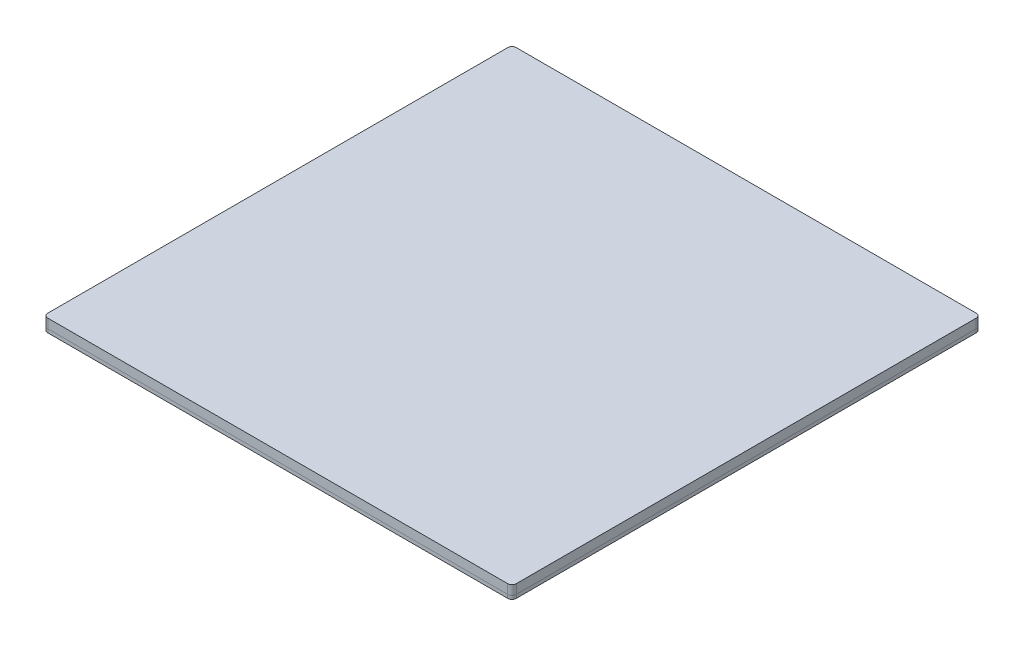
ISO-10303-21;
HEADER;
FILE_DESCRIPTION(('STEP AP214'),'2;1');
FILE_NAME('part.step','',(''),(''),'','','');
FILE_SCHEMA(('AUTOMOTIVE_DESIGN { 1 0 10303 214 1 1 1 1 }'));
ENDSEC;
DATA;
#1=APPLICATION_CONTEXT('core data for automotive mechanical design processes');
#2=APPLICATION_PROTOCOL_DEFINITION('international standard','automotive_design',2000,#1);
#3=PRODUCT_CONTEXT('',#1,'mechanical');
#4=PRODUCT('Part','Part','',(#3));
#5=PRODUCT_RELATED_PRODUCT_CATEGORY('part','',(#4));
#6=PRODUCT_DEFINITION_FORMATION('','',#4);
#7=PRODUCT_DEFINITION_CONTEXT('part definition',#1,'design');
#8=PRODUCT_DEFINITION('design','',#6,#7);
#9=PRODUCT_DEFINITION_SHAPE('','',#8);
#10=(LENGTH_UNIT() NAMED_UNIT(*) SI_UNIT(.MILLI.,.METRE.));
#11=(NAMED_UNIT(*) PLANE_ANGLE_UNIT() SI_UNIT($,.RADIAN.));
#12=(NAMED_UNIT(*) SI_UNIT($,.STERADIAN.) SOLID_ANGLE_UNIT());
#13=UNCERTAINTY_MEASURE_WITH_UNIT(LENGTH_MEASURE(1.E-05),#10,'distance_accuracy_value','');
#14=(GEOMETRIC_REPRESENTATION_CONTEXT(3) GLOBAL_UNCERTAINTY_ASSIGNED_CONTEXT((#13)) GLOBAL_UNIT_ASSIGNED_CONTEXT((#10,
#11,#12)) REPRESENTATION_CONTEXT('',''));
#15=CARTESIAN_POINT('',(0.,0.,0.));
#16=DIRECTION('',(0.,0.,1.));
#17=DIRECTION('',(1.,0.,0.));
#18=AXIS2_PLACEMENT_3D('',#15,#16,#17);
#19=CARTESIAN_POINT('',(-110.,-1.65,-110.));
#20=DIRECTION('',(0.,0.,1.));
#21=DIRECTION('',(1.,0.,0.));
#22=AXIS2_PLACEMENT_3D('',#19,#20,#21);
#23=PLANE('',#22);
#24=DIRECTION('',(1.,0.,0.));
#25=VECTOR('',#24,1.);
#26=CARTESIAN_POINT('',(-110.,-1.65,-110.));
#27=LINE('',#26,#25);
#28=CARTESIAN_POINT('',(-108.,-1.65,-110.));
#29=VERTEX_POINT('',#28);
#30=CARTESIAN_POINT('',(108.,-1.65,-110.));
#31=VERTEX_POINT('',#30);
#32=EDGE_CURVE('E130',#29,#31,#27,.T.);
#33=ORIENTED_EDGE('',*,*,#32,.F.);
#34=DIRECTION('',(0.,1.,0.));
#35=VECTOR('',#34,1.);
#36=CARTESIAN_POINT('',(-108.,-1.65,-110.));
#37=LINE('',#36,#35);
#38=CARTESIAN_POINT('',(-108.,0.,-110.));
#39=VERTEX_POINT('',#38);
#40=EDGE_CURVE('E115',#29,#39,#37,.T.);
#41=ORIENTED_EDGE('',*,*,#40,.T.);
#42=DIRECTION('',(1.,0.,0.));
#43=VECTOR('',#42,1.);
#44=CARTESIAN_POINT('',(-110.,0.,-110.));
#45=LINE('',#44,#43);
#46=CARTESIAN_POINT('',(108.,0.,-110.));
#47=VERTEX_POINT('',#46);
#48=EDGE_CURVE('E127',#39,#47,#45,.T.);
#49=ORIENTED_EDGE('',*,*,#48,.T.);
#50=DIRECTION('',(0.,1.,0.));
#51=VECTOR('',#50,1.);
#52=CARTESIAN_POINT('',(108.,-1.65,-110.));
#53=LINE('',#52,#51);
#54=EDGE_CURVE('E132',#47,#31,#53,.F.);
#55=ORIENTED_EDGE('',*,*,#54,.T.);
#56=EDGE_LOOP('',(#33,#41,#49,#55));
#57=FACE_BOUND('',#56,.T.);
#58=ADVANCED_FACE('F44',(#57),#23,.F.);
#59=CARTESIAN_POINT('',(110.,-1.65,-110.));
#60=DIRECTION('',(-1.,0.,0.));
#61=DIRECTION('',(0.,0.,1.));
#62=AXIS2_PLACEMENT_3D('',#59,#60,#61);
#63=PLANE('',#62);
#64=DIRECTION('',(0.,0.,1.));
#65=VECTOR('',#64,1.);
#66=CARTESIAN_POINT('',(110.,-1.65,-110.));
#67=LINE('',#66,#65);
#68=CARTESIAN_POINT('',(110.,-1.65,-108.));
#69=VERTEX_POINT('',#68);
#70=CARTESIAN_POINT('',(110.,-1.65,108.));
#71=VERTEX_POINT('',#70);
#72=EDGE_CURVE('E174',#69,#71,#67,.T.);
#73=ORIENTED_EDGE('',*,*,#72,.F.);
#74=DIRECTION('',(0.,1.,0.));
#75=VECTOR('',#74,1.);
#76=CARTESIAN_POINT('',(110.,-1.65,-108.));
#77=LINE('',#76,#75);
#78=CARTESIAN_POINT('',(110.,0.,-108.));
#79=VERTEX_POINT('',#78);
#80=EDGE_CURVE('E12',#69,#79,#77,.T.);
#81=ORIENTED_EDGE('',*,*,#80,.T.);
#82=DIRECTION('',(0.,0.,1.));
#83=VECTOR('',#82,1.);
#84=CARTESIAN_POINT('',(110.,0.,-110.));
#85=LINE('',#84,#83);
#86=CARTESIAN_POINT('',(110.,0.,108.));
#87=VERTEX_POINT('',#86);
#88=EDGE_CURVE('E137',#79,#87,#85,.T.);
#89=ORIENTED_EDGE('',*,*,#88,.T.);
#90=DIRECTION('',(0.,1.,0.));
#91=VECTOR('',#90,1.);
#92=CARTESIAN_POINT('',(110.,-1.65,108.));
#93=LINE('',#92,#91);
#94=EDGE_CURVE('E52',#87,#71,#93,.F.);
#95=ORIENTED_EDGE('',*,*,#94,.T.);
#96=EDGE_LOOP('',(#73,#81,#89,#95));
#97=FACE_BOUND('',#96,.T.);
#98=ADVANCED_FACE('F173',(#97),#63,.F.);
#99=CARTESIAN_POINT('',(110.,-1.65,110.));
#100=DIRECTION('',(0.,0.,-1.));
#101=DIRECTION('',(-1.,0.,0.));
#102=AXIS2_PLACEMENT_3D('',#99,#100,#101);
#103=PLANE('',#102);
#104=DIRECTION('',(-1.,0.,0.));
#105=VECTOR('',#104,1.);
#106=CARTESIAN_POINT('',(110.,0.,110.));
#107=LINE('',#106,#105);
#108=CARTESIAN_POINT('',(108.,0.,110.));
#109=VERTEX_POINT('',#108);
#110=CARTESIAN_POINT('',(-108.,0.,110.));
#111=VERTEX_POINT('',#110);
#112=EDGE_CURVE('E141',#109,#111,#107,.T.);
#113=ORIENTED_EDGE('',*,*,#112,.T.);
#114=DIRECTION('',(0.,1.,0.));
#115=VECTOR('',#114,1.);
#116=CARTESIAN_POINT('',(-108.,-1.65,110.));
#117=LINE('',#116,#115);
#118=CARTESIAN_POINT('',(-108.,-1.65,110.));
#119=VERTEX_POINT('',#118);
#120=EDGE_CURVE('E59',#111,#119,#117,.F.);
#121=ORIENTED_EDGE('',*,*,#120,.T.);
#122=DIRECTION('',(-1.,0.,0.));
#123=VECTOR('',#122,1.);
#124=CARTESIAN_POINT('',(110.,-1.65,110.));
#125=LINE('',#124,#123);
#126=CARTESIAN_POINT('',(108.,-1.65,110.));
#127=VERTEX_POINT('',#126);
#128=EDGE_CURVE('E180',#127,#119,#125,.T.);
#129=ORIENTED_EDGE('',*,*,#128,.F.);
#130=DIRECTION('',(0.,1.,0.));
#131=VECTOR('',#130,1.);
#132=CARTESIAN_POINT('',(108.,-1.65,110.));
#133=LINE('',#132,#131);
#134=EDGE_CURVE('E167',#127,#109,#133,.T.);
#135=ORIENTED_EDGE('',*,*,#134,.T.);
#136=EDGE_LOOP('',(#113,#121,#129,#135));
#137=FACE_BOUND('',#136,.T.);
#138=ADVANCED_FACE('F184',(#137),#103,.F.);
#139=CARTESIAN_POINT('',(-110.,-1.65,110.));
#140=DIRECTION('',(1.,0.,0.));
#141=DIRECTION('',(0.,0.,-1.));
#142=AXIS2_PLACEMENT_3D('',#139,#140,#141);
#143=PLANE('',#142);
#144=DIRECTION('',(0.,0.,-1.));
#145=VECTOR('',#144,1.);
#146=CARTESIAN_POINT('',(-110.,0.,110.));
#147=LINE('',#146,#145);
#148=CARTESIAN_POINT('',(-110.,0.,108.));
#149=VERTEX_POINT('',#148);
#150=CARTESIAN_POINT('',(-110.,0.,-108.));
#151=VERTEX_POINT('',#150);
#152=EDGE_CURVE('E151',#149,#151,#147,.T.);
#153=ORIENTED_EDGE('',*,*,#152,.T.);
#154=DIRECTION('',(0.,1.,0.));
#155=VECTOR('',#154,1.);
#156=CARTESIAN_POINT('',(-110.,-1.65,-108.));
#157=LINE('',#156,#155);
#158=CARTESIAN_POINT('',(-110.,-1.65,-108.));
#159=VERTEX_POINT('',#158);
#160=EDGE_CURVE('E116',#151,#159,#157,.F.);
#161=ORIENTED_EDGE('',*,*,#160,.T.);
#162=DIRECTION('',(0.,0.,-1.));
#163=VECTOR('',#162,1.);
#164=CARTESIAN_POINT('',(-110.,-1.65,110.));
#165=LINE('',#164,#163);
#166=CARTESIAN_POINT('',(-110.,-1.65,108.));
#167=VERTEX_POINT('',#166);
#168=EDGE_CURVE('E147',#167,#159,#165,.T.);
#169=ORIENTED_EDGE('',*,*,#168,.F.);
#170=DIRECTION('',(0.,1.,0.));
#171=VECTOR('',#170,1.);
#172=CARTESIAN_POINT('',(-110.,-1.65,108.));
#173=LINE('',#172,#171);
#174=EDGE_CURVE('E121',#167,#149,#173,.T.);
#175=ORIENTED_EDGE('',*,*,#174,.T.);
#176=EDGE_LOOP('',(#153,#161,#169,#175));
#177=FACE_BOUND('',#176,.T.);
#178=ADVANCED_FACE('F191',(#177),#143,.F.);
#179=CARTESIAN_POINT('',(0.,-1.65,0.));
#180=DIRECTION('',(0.,-1.,0.));
#181=DIRECTION('',(0.,0.,-1.));
#182=AXIS2_PLACEMENT_3D('',#179,#180,#181);
#183=PLANE('',#182);
#184=CARTESIAN_POINT('',(-104.5,-1.65,-104.5));
#185=DIRECTION('',(0.,1.,0.));
#186=DIRECTION('',(0.,0.,1.));
#187=AXIS2_PLACEMENT_3D('',#184,#185,#186);
#188=CIRCLE('',#187,1.5);
#189=CARTESIAN_POINT('',(-104.5,-1.65,-103.));
#190=VERTEX_POINT('',#189);
#191=EDGE_CURVE('E138',#190,#190,#188,.T.);
#192=ORIENTED_EDGE('',*,*,#191,.T.);
#193=EDGE_LOOP('',(#192));
#194=FACE_BOUND('',#193,.T.);
#195=CARTESIAN_POINT('',(104.5,-1.65,-104.5));
#196=DIRECTION('',(0.,1.,0.));
#197=DIRECTION('',(0.,0.,1.));
#198=AXIS2_PLACEMENT_3D('',#195,#196,#197);
#199=CIRCLE('',#198,1.5);
#200=CARTESIAN_POINT('',(104.5,-1.65,-103.));
#201=VERTEX_POINT('',#200);
#202=EDGE_CURVE('E209',#201,#201,#199,.T.);
#203=ORIENTED_EDGE('',*,*,#202,.T.);
#204=EDGE_LOOP('',(#203));
#205=FACE_BOUND('',#204,.T.);
#206=CARTESIAN_POINT('',(104.5,-1.65,104.5));
#207=DIRECTION('',(0.,1.,0.));
#208=DIRECTION('',(0.,0.,1.));
#209=AXIS2_PLACEMENT_3D('',#206,#207,#208);
#210=CIRCLE('',#209,1.5);
#211=CARTESIAN_POINT('',(104.5,-1.65,106.));
#212=VERTEX_POINT('',#211);
#213=EDGE_CURVE('E203',#212,#212,#210,.T.);
#214=ORIENTED_EDGE('',*,*,#213,.T.);
#215=EDGE_LOOP('',(#214));
#216=FACE_BOUND('',#215,.T.);
#217=CARTESIAN_POINT('',(-104.5,-1.65,104.5));
#218=DIRECTION('',(0.,1.,0.));
#219=DIRECTION('',(0.,0.,1.));
#220=AXIS2_PLACEMENT_3D('',#217,#218,#219);
#221=CIRCLE('',#220,1.5);
#222=CARTESIAN_POINT('',(-104.5,-1.65,106.));
#223=VERTEX_POINT('',#222);
#224=EDGE_CURVE('E197',#223,#223,#221,.T.);
#225=ORIENTED_EDGE('',*,*,#224,.T.);
#226=EDGE_LOOP('',(#225));
#227=FACE_BOUND('',#226,.T.);
#228=ORIENTED_EDGE('',*,*,#168,.T.);
#229=CARTESIAN_POINT('',(-108.,-1.65,-108.));
#230=DIRECTION('',(0.,-1.,0.));
#231=DIRECTION('',(0.,0.,-1.));
#232=AXIS2_PLACEMENT_3D('',#229,#230,#231);
#233=CIRCLE('',#232,2.);
#234=EDGE_CURVE('E165',#159,#29,#233,.T.);
#235=ORIENTED_EDGE('',*,*,#234,.T.);
#236=ORIENTED_EDGE('',*,*,#32,.T.);
#237=CARTESIAN_POINT('',(108.,-1.65,-108.));
#238=DIRECTION('',(0.,-1.,0.));
#239=DIRECTION('',(0.,0.,-1.));
#240=AXIS2_PLACEMENT_3D('',#237,#238,#239);
#241=CIRCLE('',#240,2.);
#242=EDGE_CURVE('E161',#31,#69,#241,.T.);
#243=ORIENTED_EDGE('',*,*,#242,.T.);
#244=ORIENTED_EDGE('',*,*,#72,.T.);
#245=CARTESIAN_POINT('',(108.,-1.65,108.));
#246=DIRECTION('',(0.,-1.,0.));
#247=DIRECTION('',(0.,0.,-1.));
#248=AXIS2_PLACEMENT_3D('',#245,#246,#247);
#249=CIRCLE('',#248,2.);
#250=EDGE_CURVE('E66',#71,#127,#249,.T.);
#251=ORIENTED_EDGE('',*,*,#250,.T.);
#252=ORIENTED_EDGE('',*,*,#128,.T.);
#253=CARTESIAN_POINT('',(-108.,-1.65,108.));
#254=DIRECTION('',(0.,-1.,0.));
#255=DIRECTION('',(0.,0.,-1.));
#256=AXIS2_PLACEMENT_3D('',#253,#254,#255);
#257=CIRCLE('',#256,2.);
#258=EDGE_CURVE('E163',#119,#167,#257,.T.);
#259=ORIENTED_EDGE('',*,*,#258,.T.);
#260=EDGE_LOOP('',(#228,#235,#236,#243,#244,#251,#252,#259));
#261=FACE_BOUND('',#260,.T.);
#262=ADVANCED_FACE('F178',(#194,#205,#216,#227,#261),#183,.T.);
#263=CARTESIAN_POINT('',(0.,0.,0.));
#264=DIRECTION('',(0.,-1.,0.));
#265=DIRECTION('',(0.,0.,-1.));
#266=AXIS2_PLACEMENT_3D('',#263,#264,#265);
#267=PLANE('',#266);
#268=CARTESIAN_POINT('',(-104.5,0.,-104.5));
#269=DIRECTION('',(0.,1.,0.));
#270=DIRECTION('',(0.,0.,1.));
#271=AXIS2_PLACEMENT_3D('',#268,#269,#270);
#272=CIRCLE('',#271,1.5);
#273=CARTESIAN_POINT('',(-104.5,0.,-103.));
#274=VERTEX_POINT('',#273);
#275=EDGE_CURVE('E144',#274,#274,#272,.T.);
#276=ORIENTED_EDGE('',*,*,#275,.F.);
#277=EDGE_LOOP('',(#276));
#278=FACE_BOUND('',#277,.T.);
#279=CARTESIAN_POINT('',(104.5,0.,-104.5));
#280=DIRECTION('',(0.,1.,0.));
#281=DIRECTION('',(0.,0.,1.));
#282=AXIS2_PLACEMENT_3D('',#279,#280,#281);
#283=CIRCLE('',#282,1.5);
#284=CARTESIAN_POINT('',(104.5,0.,-103.));
#285=VERTEX_POINT('',#284);
#286=EDGE_CURVE('E206',#285,#285,#283,.T.);
#287=ORIENTED_EDGE('',*,*,#286,.F.);
#288=EDGE_LOOP('',(#287));
#289=FACE_BOUND('',#288,.T.);
#290=CARTESIAN_POINT('',(104.5,0.,104.5));
#291=DIRECTION('',(0.,1.,0.));
#292=DIRECTION('',(0.,0.,1.));
#293=AXIS2_PLACEMENT_3D('',#290,#291,#292);
#294=CIRCLE('',#293,1.5);
#295=CARTESIAN_POINT('',(104.5,0.,106.));
#296=VERTEX_POINT('',#295);
#297=EDGE_CURVE('E200',#296,#296,#294,.T.);
#298=ORIENTED_EDGE('',*,*,#297,.F.);
#299=EDGE_LOOP('',(#298));
#300=FACE_BOUND('',#299,.T.);
#301=CARTESIAN_POINT('',(-104.5,0.,104.5));
#302=DIRECTION('',(0.,1.,0.));
#303=DIRECTION('',(0.,0.,1.));
#304=AXIS2_PLACEMENT_3D('',#301,#302,#303);
#305=CIRCLE('',#304,1.5);
#306=CARTESIAN_POINT('',(-104.5,0.,106.));
#307=VERTEX_POINT('',#306);
#308=EDGE_CURVE('E194',#307,#307,#305,.T.);
#309=ORIENTED_EDGE('',*,*,#308,.F.);
#310=EDGE_LOOP('',(#309));
#311=FACE_BOUND('',#310,.T.);
#312=ORIENTED_EDGE('',*,*,#48,.F.);
#313=CARTESIAN_POINT('',(-108.,0.,-108.));
#314=DIRECTION('',(0.,-1.,0.));
#315=DIRECTION('',(0.,0.,-1.));
#316=AXIS2_PLACEMENT_3D('',#313,#314,#315);
#317=CIRCLE('',#316,2.);
#318=EDGE_CURVE('E111',#39,#151,#317,.F.);
#319=ORIENTED_EDGE('',*,*,#318,.T.);
#320=ORIENTED_EDGE('',*,*,#152,.F.);
#321=CARTESIAN_POINT('',(-108.,0.,108.));
#322=DIRECTION('',(0.,-1.,0.));
#323=DIRECTION('',(0.,0.,-1.));
#324=AXIS2_PLACEMENT_3D('',#321,#322,#323);
#325=CIRCLE('',#324,2.);
#326=EDGE_CURVE('E122',#149,#111,#325,.F.);
#327=ORIENTED_EDGE('',*,*,#326,.T.);
#328=ORIENTED_EDGE('',*,*,#112,.F.);
#329=CARTESIAN_POINT('',(108.,0.,108.));
#330=DIRECTION('',(0.,-1.,0.));
#331=DIRECTION('',(0.,0.,-1.));
#332=AXIS2_PLACEMENT_3D('',#329,#330,#331);
#333=CIRCLE('',#332,2.);
#334=EDGE_CURVE('E131',#109,#87,#333,.F.);
#335=ORIENTED_EDGE('',*,*,#334,.T.);
#336=ORIENTED_EDGE('',*,*,#88,.F.);
#337=CARTESIAN_POINT('',(108.,0.,-108.));
#338=DIRECTION('',(0.,-1.,0.));
#339=DIRECTION('',(0.,0.,-1.));
#340=AXIS2_PLACEMENT_3D('',#337,#338,#339);
#341=CIRCLE('',#340,2.);
#342=EDGE_CURVE('E136',#79,#47,#341,.F.);
#343=ORIENTED_EDGE('',*,*,#342,.T.);
#344=EDGE_LOOP('',(#312,#319,#320,#327,#328,#335,#336,#343));
#345=FACE_BOUND('',#344,.T.);
#346=ADVANCED_FACE('F134',(#278,#289,#300,#311,#345),#267,.F.);
#347=CARTESIAN_POINT('',(-104.5,-1.65,104.5));
#348=DIRECTION('',(0.,1.,0.));
#349=DIRECTION('',(0.,0.,1.));
#350=AXIS2_PLACEMENT_3D('',#347,#348,#349);
#351=CYLINDRICAL_SURFACE('',#350,1.5);
#352=ORIENTED_EDGE('',*,*,#224,.F.);
#353=EDGE_LOOP('',(#352));
#354=FACE_BOUND('',#353,.T.);
#355=ORIENTED_EDGE('',*,*,#308,.T.);
#356=EDGE_LOOP('',(#355));
#357=FACE_BOUND('',#356,.T.);
#358=ADVANCED_FACE('F219',(#354,#357),#351,.F.);
#359=CARTESIAN_POINT('',(104.5,-1.65,104.5));
#360=DIRECTION('',(0.,1.,0.));
#361=DIRECTION('',(0.,0.,1.));
#362=AXIS2_PLACEMENT_3D('',#359,#360,#361);
#363=CYLINDRICAL_SURFACE('',#362,1.5);
#364=ORIENTED_EDGE('',*,*,#213,.F.);
#365=EDGE_LOOP('',(#364));
#366=FACE_BOUND('',#365,.T.);
#367=ORIENTED_EDGE('',*,*,#297,.T.);
#368=EDGE_LOOP('',(#367));
#369=FACE_BOUND('',#368,.T.);
#370=ADVANCED_FACE('F228',(#366,#369),#363,.F.);
#371=CARTESIAN_POINT('',(104.5,-1.65,-104.5));
#372=DIRECTION('',(0.,1.,0.));
#373=DIRECTION('',(0.,0.,1.));
#374=AXIS2_PLACEMENT_3D('',#371,#372,#373);
#375=CYLINDRICAL_SURFACE('',#374,1.5);
#376=ORIENTED_EDGE('',*,*,#202,.F.);
#377=EDGE_LOOP('',(#376));
#378=FACE_BOUND('',#377,.T.);
#379=ORIENTED_EDGE('',*,*,#286,.T.);
#380=EDGE_LOOP('',(#379));
#381=FACE_BOUND('',#380,.T.);
#382=ADVANCED_FACE('F234',(#378,#381),#375,.F.);
#383=CARTESIAN_POINT('',(-104.5,-1.65,-104.5));
#384=DIRECTION('',(0.,1.,0.));
#385=DIRECTION('',(0.,0.,1.));
#386=AXIS2_PLACEMENT_3D('',#383,#384,#385);
#387=CYLINDRICAL_SURFACE('',#386,1.5);
#388=ORIENTED_EDGE('',*,*,#191,.F.);
#389=EDGE_LOOP('',(#388));
#390=FACE_BOUND('',#389,.T.);
#391=ORIENTED_EDGE('',*,*,#275,.T.);
#392=EDGE_LOOP('',(#391));
#393=FACE_BOUND('',#392,.T.);
#394=ADVANCED_FACE('F215',(#390,#393),#387,.F.);
#395=CARTESIAN_POINT('',(-108.,-1.65,-108.));
#396=DIRECTION('',(0.,1.,0.));
#397=DIRECTION('',(0.,0.,1.));
#398=AXIS2_PLACEMENT_3D('',#395,#396,#397);
#399=CYLINDRICAL_SURFACE('',#398,2.);
#400=ORIENTED_EDGE('',*,*,#234,.F.);
#401=ORIENTED_EDGE('',*,*,#160,.F.);
#402=ORIENTED_EDGE('',*,*,#318,.F.);
#403=ORIENTED_EDGE('',*,*,#40,.F.);
#404=EDGE_LOOP('',(#400,#401,#402,#403));
#405=FACE_BOUND('',#404,.T.);
#406=ADVANCED_FACE('F114',(#405),#399,.T.);
#407=CARTESIAN_POINT('',(-108.,-1.65,108.));
#408=DIRECTION('',(0.,1.,0.));
#409=DIRECTION('',(0.,0.,1.));
#410=AXIS2_PLACEMENT_3D('',#407,#408,#409);
#411=CYLINDRICAL_SURFACE('',#410,2.);
#412=ORIENTED_EDGE('',*,*,#258,.F.);
#413=ORIENTED_EDGE('',*,*,#120,.F.);
#414=ORIENTED_EDGE('',*,*,#326,.F.);
#415=ORIENTED_EDGE('',*,*,#174,.F.);
#416=EDGE_LOOP('',(#412,#413,#414,#415));
#417=FACE_BOUND('',#416,.T.);
#418=ADVANCED_FACE('F188',(#417),#411,.T.);
#419=CARTESIAN_POINT('',(108.,-1.65,-108.));
#420=DIRECTION('',(0.,1.,0.));
#421=DIRECTION('',(0.,0.,1.));
#422=AXIS2_PLACEMENT_3D('',#419,#420,#421);
#423=CYLINDRICAL_SURFACE('',#422,2.);
#424=ORIENTED_EDGE('',*,*,#242,.F.);
#425=ORIENTED_EDGE('',*,*,#54,.F.);
#426=ORIENTED_EDGE('',*,*,#342,.F.);
#427=ORIENTED_EDGE('',*,*,#80,.F.);
#428=EDGE_LOOP('',(#424,#425,#426,#427));
#429=FACE_BOUND('',#428,.T.);
#430=ADVANCED_FACE('F250',(#429),#423,.T.);
#431=CARTESIAN_POINT('',(108.,-1.65,108.));
#432=DIRECTION('',(0.,1.,0.));
#433=DIRECTION('',(0.,0.,1.));
#434=AXIS2_PLACEMENT_3D('',#431,#432,#433);
#435=CYLINDRICAL_SURFACE('',#434,2.);
#436=ORIENTED_EDGE('',*,*,#250,.F.);
#437=ORIENTED_EDGE('',*,*,#94,.F.);
#438=ORIENTED_EDGE('',*,*,#334,.F.);
#439=ORIENTED_EDGE('',*,*,#134,.F.);
#440=EDGE_LOOP('',(#436,#437,#438,#439));
#441=FACE_BOUND('',#440,.T.);
#442=ADVANCED_FACE('F46',(#441),#435,.T.);
#443=CLOSED_SHELL('',(#58,#98,#138,#178,#262,#346,#358,#370,#382,#394,#406,#418,#430,#442));
#444=MANIFOLD_SOLID_BREP('B2',#443);
#445=CARTESIAN_POINT('',(110.,4.35,110.));
#446=DIRECTION('',(-1.,0.,0.));
#447=DIRECTION('',(0.,0.,1.));
#448=AXIS2_PLACEMENT_3D('',#445,#446,#447);
#449=PLANE('',#448);
#450=DIRECTION('',(0.,0.,-1.));
#451=VECTOR('',#450,1.);
#452=CARTESIAN_POINT('',(110.,4.35,110.));
#453=LINE('',#452,#451);
#454=CARTESIAN_POINT('',(110.,4.35,108.));
#455=VERTEX_POINT('',#454);
#456=CARTESIAN_POINT('',(110.,4.35,-108.));
#457=VERTEX_POINT('',#456);
#458=EDGE_CURVE('E442',#455,#457,#453,.T.);
#459=ORIENTED_EDGE('',*,*,#458,.F.);
#460=DIRECTION('',(0.,-1.,0.));
#461=VECTOR('',#460,1.);
#462=CARTESIAN_POINT('',(110.,4.35,108.));
#463=LINE('',#462,#461);
#464=CARTESIAN_POINT('',(110.,0.,108.));
#465=VERTEX_POINT('',#464);
#466=EDGE_CURVE('E427',#455,#465,#463,.T.);
#467=ORIENTED_EDGE('',*,*,#466,.T.);
#468=DIRECTION('',(0.,0.,-1.));
#469=VECTOR('',#468,1.);
#470=CARTESIAN_POINT('',(110.,0.,110.));
#471=LINE('',#470,#469);
#472=CARTESIAN_POINT('',(110.,0.,-108.));
#473=VERTEX_POINT('',#472);
#474=EDGE_CURVE('E439',#465,#473,#471,.T.);
#475=ORIENTED_EDGE('',*,*,#474,.T.);
#476=DIRECTION('',(0.,-1.,0.));
#477=VECTOR('',#476,1.);
#478=CARTESIAN_POINT('',(110.,4.35,-108.));
#479=LINE('',#478,#477);
#480=EDGE_CURVE('E444',#473,#457,#479,.F.);
#481=ORIENTED_EDGE('',*,*,#480,.T.);
#482=EDGE_LOOP('',(#459,#467,#475,#481));
#483=FACE_BOUND('',#482,.T.);
#484=ADVANCED_FACE('F357',(#483),#449,.F.);
#485=CARTESIAN_POINT('',(-110.,4.35,-110.));
#486=DIRECTION('',(0.,0.,1.));
#487=DIRECTION('',(1.,0.,0.));
#488=AXIS2_PLACEMENT_3D('',#485,#486,#487);
#489=PLANE('',#488);
#490=DIRECTION('',(-1.,0.,0.));
#491=VECTOR('',#490,1.);
#492=CARTESIAN_POINT('',(-110.,4.35,-110.));
#493=LINE('',#492,#491);
#494=CARTESIAN_POINT('',(108.,4.35,-110.));
#495=VERTEX_POINT('',#494);
#496=CARTESIAN_POINT('',(-108.,4.35,-110.));
#497=VERTEX_POINT('',#496);
#498=EDGE_CURVE('E484',#495,#497,#493,.T.);
#499=ORIENTED_EDGE('',*,*,#498,.F.);
#500=DIRECTION('',(0.,-1.,0.));
#501=VECTOR('',#500,1.);
#502=CARTESIAN_POINT('',(108.,4.35,-110.));
#503=LINE('',#502,#501);
#504=CARTESIAN_POINT('',(108.,0.,-110.));
#505=VERTEX_POINT('',#504);
#506=EDGE_CURVE('E477',#495,#505,#503,.T.);
#507=ORIENTED_EDGE('',*,*,#506,.T.);
#508=DIRECTION('',(-1.,0.,0.));
#509=VECTOR('',#508,1.);
#510=CARTESIAN_POINT('',(-110.,0.,-110.));
#511=LINE('',#510,#509);
#512=CARTESIAN_POINT('',(-108.,0.,-110.));
#513=VERTEX_POINT('',#512);
#514=EDGE_CURVE('E448',#505,#513,#511,.T.);
#515=ORIENTED_EDGE('',*,*,#514,.T.);
#516=DIRECTION('',(0.,-1.,0.));
#517=VECTOR('',#516,1.);
#518=CARTESIAN_POINT('',(-108.,4.35,-110.));
#519=LINE('',#518,#517);
#520=EDGE_CURVE('E475',#513,#497,#519,.F.);
#521=ORIENTED_EDGE('',*,*,#520,.T.);
#522=EDGE_LOOP('',(#499,#507,#515,#521));
#523=FACE_BOUND('',#522,.T.);
#524=ADVANCED_FACE('F482',(#523),#489,.F.);
#525=CARTESIAN_POINT('',(-110.,4.35,110.));
#526=DIRECTION('',(1.,0.,0.));
#527=DIRECTION('',(0.,0.,-1.));
#528=AXIS2_PLACEMENT_3D('',#525,#526,#527);
#529=PLANE('',#528);
#530=DIRECTION('',(0.,0.,1.));
#531=VECTOR('',#530,1.);
#532=CARTESIAN_POINT('',(-110.,4.35,110.));
#533=LINE('',#532,#531);
#534=CARTESIAN_POINT('',(-110.,4.35,-108.));
#535=VERTEX_POINT('',#534);
#536=CARTESIAN_POINT('',(-110.,4.35,108.));
#537=VERTEX_POINT('',#536);
#538=EDGE_CURVE('E492',#535,#537,#533,.T.);
#539=ORIENTED_EDGE('',*,*,#538,.F.);
#540=DIRECTION('',(0.,-1.,0.));
#541=VECTOR('',#540,1.);
#542=CARTESIAN_POINT('',(-110.,4.35,-108.));
#543=LINE('',#542,#541);
#544=CARTESIAN_POINT('',(-110.,0.,-108.));
#545=VERTEX_POINT('',#544);
#546=EDGE_CURVE('E42',#535,#545,#543,.T.);
#547=ORIENTED_EDGE('',*,*,#546,.T.);
#548=DIRECTION('',(0.,0.,1.));
#549=VECTOR('',#548,1.);
#550=CARTESIAN_POINT('',(-110.,0.,110.));
#551=LINE('',#550,#549);
#552=CARTESIAN_POINT('',(-110.,0.,108.));
#553=VERTEX_POINT('',#552);
#554=EDGE_CURVE('E451',#545,#553,#551,.T.);
#555=ORIENTED_EDGE('',*,*,#554,.T.);
#556=DIRECTION('',(0.,-1.,0.));
#557=VECTOR('',#556,1.);
#558=CARTESIAN_POINT('',(-110.,4.35,108.));
#559=LINE('',#558,#557);
#560=EDGE_CURVE('E365',#553,#537,#559,.F.);
#561=ORIENTED_EDGE('',*,*,#560,.T.);
#562=EDGE_LOOP('',(#539,#547,#555,#561));
#563=FACE_BOUND('',#562,.T.);
#564=ADVANCED_FACE('F491',(#563),#529,.F.);
#565=CARTESIAN_POINT('',(-110.,4.35,110.));
#566=DIRECTION('',(0.,0.,-1.));
#567=DIRECTION('',(-1.,0.,0.));
#568=AXIS2_PLACEMENT_3D('',#565,#566,#567);
#569=PLANE('',#568);
#570=DIRECTION('',(1.,0.,0.));
#571=VECTOR('',#570,1.);
#572=CARTESIAN_POINT('',(-110.,0.,110.));
#573=LINE('',#572,#571);
#574=CARTESIAN_POINT('',(-108.,0.,110.));
#575=VERTEX_POINT('',#574);
#576=CARTESIAN_POINT('',(108.,0.,110.));
#577=VERTEX_POINT('',#576);
#578=EDGE_CURVE('E458',#575,#577,#573,.T.);
#579=ORIENTED_EDGE('',*,*,#578,.T.);
#580=DIRECTION('',(0.,-1.,0.));
#581=VECTOR('',#580,1.);
#582=CARTESIAN_POINT('',(108.,4.35,110.));
#583=LINE('',#582,#581);
#584=CARTESIAN_POINT('',(108.,4.35,110.));
#585=VERTEX_POINT('',#584);
#586=EDGE_CURVE('E428',#577,#585,#583,.F.);
#587=ORIENTED_EDGE('',*,*,#586,.T.);
#588=DIRECTION('',(1.,0.,0.));
#589=VECTOR('',#588,1.);
#590=CARTESIAN_POINT('',(-110.,4.35,110.));
#591=LINE('',#590,#589);
#592=CARTESIAN_POINT('',(-108.,4.35,110.));
#593=VERTEX_POINT('',#592);
#594=EDGE_CURVE('E454',#593,#585,#591,.T.);
#595=ORIENTED_EDGE('',*,*,#594,.F.);
#596=DIRECTION('',(0.,-1.,0.));
#597=VECTOR('',#596,1.);
#598=CARTESIAN_POINT('',(-108.,4.35,110.));
#599=LINE('',#598,#597);
#600=EDGE_CURVE('E433',#593,#575,#599,.T.);
#601=ORIENTED_EDGE('',*,*,#600,.T.);
#602=EDGE_LOOP('',(#579,#587,#595,#601));
#603=FACE_BOUND('',#602,.T.);
#604=ADVANCED_FACE('F515',(#603),#569,.F.);
#605=CARTESIAN_POINT('',(0.,4.35,0.));
#606=DIRECTION('',(0.,-1.,0.));
#607=DIRECTION('',(0.,0.,-1.));
#608=AXIS2_PLACEMENT_3D('',#605,#606,#607);
#609=PLANE('',#608);
#610=ORIENTED_EDGE('',*,*,#594,.T.);
#611=CARTESIAN_POINT('',(108.,4.35,108.));
#612=DIRECTION('',(0.,-1.,0.));
#613=DIRECTION('',(0.,0.,-1.));
#614=AXIS2_PLACEMENT_3D('',#611,#612,#613);
#615=CIRCLE('',#614,2.);
#616=EDGE_CURVE('E473',#585,#455,#615,.F.);
#617=ORIENTED_EDGE('',*,*,#616,.T.);
#618=ORIENTED_EDGE('',*,*,#458,.T.);
#619=CARTESIAN_POINT('',(108.,4.35,-108.));
#620=DIRECTION('',(0.,-1.,0.));
#621=DIRECTION('',(0.,0.,-1.));
#622=AXIS2_PLACEMENT_3D('',#619,#620,#621);
#623=CIRCLE('',#622,2.);
#624=EDGE_CURVE('E471',#457,#495,#623,.F.);
#625=ORIENTED_EDGE('',*,*,#624,.T.);
#626=ORIENTED_EDGE('',*,*,#498,.T.);
#627=CARTESIAN_POINT('',(-108.,4.35,-108.));
#628=DIRECTION('',(0.,-1.,0.));
#629=DIRECTION('',(0.,0.,-1.));
#630=AXIS2_PLACEMENT_3D('',#627,#628,#629);
#631=CIRCLE('',#630,2.);
#632=EDGE_CURVE('E378',#497,#535,#631,.F.);
#633=ORIENTED_EDGE('',*,*,#632,.T.);
#634=ORIENTED_EDGE('',*,*,#538,.T.);
#635=CARTESIAN_POINT('',(-108.,4.35,108.));
#636=DIRECTION('',(0.,-1.,0.));
#637=DIRECTION('',(0.,0.,-1.));
#638=AXIS2_PLACEMENT_3D('',#635,#636,#637);
#639=CIRCLE('',#638,2.);
#640=EDGE_CURVE('E468',#537,#593,#639,.F.);
#641=ORIENTED_EDGE('',*,*,#640,.T.);
#642=EDGE_LOOP('',(#610,#617,#618,#625,#626,#633,#634,#641));
#643=FACE_BOUND('',#642,.T.);
#644=ADVANCED_FACE('F497',(#643),#609,.F.);
#645=CARTESIAN_POINT('',(0.,0.,0.));
#646=DIRECTION('',(0.,-1.,0.));
#647=DIRECTION('',(0.,0.,-1.));
#648=AXIS2_PLACEMENT_3D('',#645,#646,#647);
#649=PLANE('',#648);
#650=ORIENTED_EDGE('',*,*,#474,.F.);
#651=CARTESIAN_POINT('',(108.,0.,108.));
#652=DIRECTION('',(0.,-1.,0.));
#653=DIRECTION('',(0.,0.,-1.));
#654=AXIS2_PLACEMENT_3D('',#651,#652,#653);
#655=CIRCLE('',#654,2.);
#656=EDGE_CURVE('E423',#465,#577,#655,.T.);
#657=ORIENTED_EDGE('',*,*,#656,.T.);
#658=ORIENTED_EDGE('',*,*,#578,.F.);
#659=CARTESIAN_POINT('',(-108.,0.,108.));
#660=DIRECTION('',(0.,-1.,0.));
#661=DIRECTION('',(0.,0.,-1.));
#662=AXIS2_PLACEMENT_3D('',#659,#660,#661);
#663=CIRCLE('',#662,2.);
#664=EDGE_CURVE('E443',#575,#553,#663,.T.);
#665=ORIENTED_EDGE('',*,*,#664,.T.);
#666=ORIENTED_EDGE('',*,*,#554,.F.);
#667=CARTESIAN_POINT('',(-108.,0.,-108.));
#668=DIRECTION('',(0.,-1.,0.));
#669=DIRECTION('',(0.,0.,-1.));
#670=AXIS2_PLACEMENT_3D('',#667,#668,#669);
#671=CIRCLE('',#670,2.);
#672=EDGE_CURVE('E462',#545,#513,#671,.T.);
#673=ORIENTED_EDGE('',*,*,#672,.T.);
#674=ORIENTED_EDGE('',*,*,#514,.F.);
#675=CARTESIAN_POINT('',(108.,0.,-108.));
#676=DIRECTION('',(0.,-1.,0.));
#677=DIRECTION('',(0.,0.,-1.));
#678=AXIS2_PLACEMENT_3D('',#675,#676,#677);
#679=CIRCLE('',#678,2.);
#680=EDGE_CURVE('E434',#505,#473,#679,.T.);
#681=ORIENTED_EDGE('',*,*,#680,.T.);
#682=EDGE_LOOP('',(#650,#657,#658,#665,#666,#673,#674,#681));
#683=FACE_BOUND('',#682,.T.);
#684=ADVANCED_FACE('F446',(#683),#649,.T.);
#685=CARTESIAN_POINT('',(108.,4.35,108.));
#686=DIRECTION('',(0.,-1.,0.));
#687=DIRECTION('',(0.,0.,-1.));
#688=AXIS2_PLACEMENT_3D('',#685,#686,#687);
#689=CYLINDRICAL_SURFACE('',#688,2.);
#690=ORIENTED_EDGE('',*,*,#616,.F.);
#691=ORIENTED_EDGE('',*,*,#586,.F.);
#692=ORIENTED_EDGE('',*,*,#656,.F.);
#693=ORIENTED_EDGE('',*,*,#466,.F.);
#694=EDGE_LOOP('',(#690,#691,#692,#693));
#695=FACE_BOUND('',#694,.T.);
#696=ADVANCED_FACE('F426',(#695),#689,.T.);
#697=CARTESIAN_POINT('',(108.,4.35,-108.));
#698=DIRECTION('',(0.,-1.,0.));
#699=DIRECTION('',(0.,0.,-1.));
#700=AXIS2_PLACEMENT_3D('',#697,#698,#699);
#701=CYLINDRICAL_SURFACE('',#700,2.);
#702=ORIENTED_EDGE('',*,*,#624,.F.);
#703=ORIENTED_EDGE('',*,*,#480,.F.);
#704=ORIENTED_EDGE('',*,*,#680,.F.);
#705=ORIENTED_EDGE('',*,*,#506,.F.);
#706=EDGE_LOOP('',(#702,#703,#704,#705));
#707=FACE_BOUND('',#706,.T.);
#708=ADVANCED_FACE('F498',(#707),#701,.T.);
#709=CARTESIAN_POINT('',(-108.,4.35,-108.));
#710=DIRECTION('',(0.,-1.,0.));
#711=DIRECTION('',(0.,0.,-1.));
#712=AXIS2_PLACEMENT_3D('',#709,#710,#711);
#713=CYLINDRICAL_SURFACE('',#712,2.);
#714=ORIENTED_EDGE('',*,*,#632,.F.);
#715=ORIENTED_EDGE('',*,*,#520,.F.);
#716=ORIENTED_EDGE('',*,*,#672,.F.);
#717=ORIENTED_EDGE('',*,*,#546,.F.);
#718=EDGE_LOOP('',(#714,#715,#716,#717));
#719=FACE_BOUND('',#718,.T.);
#720=ADVANCED_FACE('F490',(#719),#713,.T.);
#721=CARTESIAN_POINT('',(-108.,4.35,108.));
#722=DIRECTION('',(0.,-1.,0.));
#723=DIRECTION('',(0.,0.,-1.));
#724=AXIS2_PLACEMENT_3D('',#721,#722,#723);
#725=CYLINDRICAL_SURFACE('',#724,2.);
#726=ORIENTED_EDGE('',*,*,#640,.F.);
#727=ORIENTED_EDGE('',*,*,#560,.F.);
#728=ORIENTED_EDGE('',*,*,#664,.F.);
#729=ORIENTED_EDGE('',*,*,#600,.F.);
#730=EDGE_LOOP('',(#726,#727,#728,#729));
#731=FACE_BOUND('',#730,.T.);
#732=ADVANCED_FACE('F359',(#731),#725,.T.);
#733=CLOSED_SHELL('',(#484,#524,#564,#604,#644,#684,#696,#708,#720,#732));
#734=MANIFOLD_SOLID_BREP('B6',#733);
#735=ADVANCED_BREP_SHAPE_REPRESENTATION('',(#18,#444,#734),#14);
#736=SHAPE_DEFINITION_REPRESENTATION(#9,#735);
ENDSEC;
END-ISO-10303-21;
